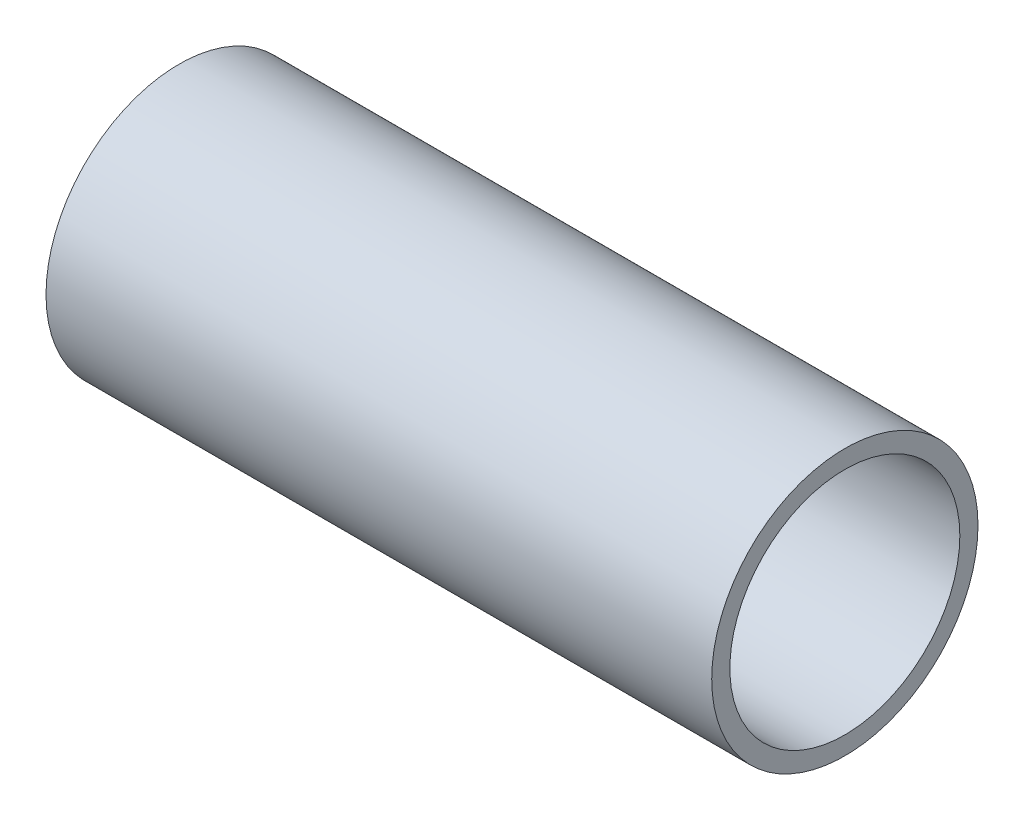
ISO-10303-21;
HEADER;
FILE_DESCRIPTION(('STEP AP214'),'2;1');
FILE_NAME('part.step','',(''),(''),'','','');
FILE_SCHEMA(('AUTOMOTIVE_DESIGN { 1 0 10303 214 1 1 1 1 }'));
ENDSEC;
DATA;
#1=APPLICATION_CONTEXT('core data for automotive mechanical design processes');
#2=APPLICATION_PROTOCOL_DEFINITION('international standard','automotive_design',2000,#1);
#3=PRODUCT_CONTEXT('',#1,'mechanical');
#4=PRODUCT('Part','Part','',(#3));
#5=PRODUCT_RELATED_PRODUCT_CATEGORY('part','',(#4));
#6=PRODUCT_DEFINITION_FORMATION('','',#4);
#7=PRODUCT_DEFINITION_CONTEXT('part definition',#1,'design');
#8=PRODUCT_DEFINITION('design','',#6,#7);
#9=PRODUCT_DEFINITION_SHAPE('','',#8);
#10=(LENGTH_UNIT() NAMED_UNIT(*) SI_UNIT(.MILLI.,.METRE.));
#11=(NAMED_UNIT(*) PLANE_ANGLE_UNIT() SI_UNIT($,.RADIAN.));
#12=(NAMED_UNIT(*) SI_UNIT($,.STERADIAN.) SOLID_ANGLE_UNIT());
#13=UNCERTAINTY_MEASURE_WITH_UNIT(LENGTH_MEASURE(1.E-05),#10,'distance_accuracy_value','');
#14=(GEOMETRIC_REPRESENTATION_CONTEXT(3) GLOBAL_UNCERTAINTY_ASSIGNED_CONTEXT((#13)) GLOBAL_UNIT_ASSIGNED_CONTEXT((#10,
#11,#12)) REPRESENTATION_CONTEXT('',''));
#15=CARTESIAN_POINT('',(0.,0.,0.));
#16=DIRECTION('',(0.,0.,1.));
#17=DIRECTION('',(1.,0.,0.));
#18=AXIS2_PLACEMENT_3D('',#15,#16,#17);
#19=CARTESIAN_POINT('',(55.,0.,0.));
#20=DIRECTION('',(1.,0.,0.));
#21=DIRECTION('',(0.,0.,-1.));
#22=AXIS2_PLACEMENT_3D('',#19,#20,#21);
#23=PLANE('',#22);
#24=CARTESIAN_POINT('',(55.,0.,0.));
#25=DIRECTION('',(1.,0.,0.));
#26=DIRECTION('',(0.,0.,-1.));
#27=AXIS2_PLACEMENT_3D('',#24,#25,#26);
#28=CIRCLE('',#27,11.);
#29=CARTESIAN_POINT('',(55.,0.,-11.));
#30=VERTEX_POINT('',#29);
#31=EDGE_CURVE('E10',#30,#30,#28,.T.);
#32=ORIENTED_EDGE('',*,*,#31,.T.);
#33=EDGE_LOOP('',(#32));
#34=FACE_BOUND('',#33,.T.);
#35=CARTESIAN_POINT('',(55.,0.,0.));
#36=DIRECTION('',(1.,0.,0.));
#37=DIRECTION('',(0.,0.,-1.));
#38=AXIS2_PLACEMENT_3D('',#35,#36,#37);
#39=CIRCLE('',#38,9.5);
#40=CARTESIAN_POINT('',(55.,0.,-9.5));
#41=VERTEX_POINT('',#40);
#42=EDGE_CURVE('E42',#41,#41,#39,.T.);
#43=ORIENTED_EDGE('',*,*,#42,.F.);
#44=EDGE_LOOP('',(#43));
#45=FACE_BOUND('',#44,.T.);
#46=ADVANCED_FACE('F31',(#34,#45),#23,.T.);
#47=CARTESIAN_POINT('',(0.,0.,0.));
#48=DIRECTION('',(1.,0.,0.));
#49=DIRECTION('',(0.,0.,-1.));
#50=AXIS2_PLACEMENT_3D('',#47,#48,#49);
#51=PLANE('',#50);
#52=CARTESIAN_POINT('',(0.,0.,0.));
#53=DIRECTION('',(1.,0.,0.));
#54=DIRECTION('',(0.,0.,-1.));
#55=AXIS2_PLACEMENT_3D('',#52,#53,#54);
#56=CIRCLE('',#55,11.);
#57=CARTESIAN_POINT('',(0.,0.,-11.));
#58=VERTEX_POINT('',#57);
#59=EDGE_CURVE('E35',#58,#58,#56,.T.);
#60=ORIENTED_EDGE('',*,*,#59,.F.);
#61=EDGE_LOOP('',(#60));
#62=FACE_BOUND('',#61,.T.);
#63=CARTESIAN_POINT('',(0.,0.,0.));
#64=DIRECTION('',(1.,0.,0.));
#65=DIRECTION('',(0.,0.,-1.));
#66=AXIS2_PLACEMENT_3D('',#63,#64,#65);
#67=CIRCLE('',#66,9.5);
#68=CARTESIAN_POINT('',(0.,0.,-9.5));
#69=VERTEX_POINT('',#68);
#70=EDGE_CURVE('E44',#69,#69,#67,.T.);
#71=ORIENTED_EDGE('',*,*,#70,.T.);
#72=EDGE_LOOP('',(#71));
#73=FACE_BOUND('',#72,.T.);
#74=ADVANCED_FACE('F54',(#62,#73),#51,.F.);
#75=CARTESIAN_POINT('',(55.,0.,0.));
#76=DIRECTION('',(-1.,0.,0.));
#77=DIRECTION('',(0.,0.,1.));
#78=AXIS2_PLACEMENT_3D('',#75,#76,#77);
#79=CYLINDRICAL_SURFACE('',#78,11.);
#80=ORIENTED_EDGE('',*,*,#31,.F.);
#81=EDGE_LOOP('',(#80));
#82=FACE_BOUND('',#81,.T.);
#83=ORIENTED_EDGE('',*,*,#59,.T.);
#84=EDGE_LOOP('',(#83));
#85=FACE_BOUND('',#84,.T.);
#86=ADVANCED_FACE('F33',(#82,#85),#79,.T.);
#87=CARTESIAN_POINT('',(55.,0.,0.));
#88=DIRECTION('',(-1.,0.,0.));
#89=DIRECTION('',(0.,0.,1.));
#90=AXIS2_PLACEMENT_3D('',#87,#88,#89);
#91=CYLINDRICAL_SURFACE('',#90,9.5);
#92=ORIENTED_EDGE('',*,*,#42,.T.);
#93=EDGE_LOOP('',(#92));
#94=FACE_BOUND('',#93,.T.);
#95=ORIENTED_EDGE('',*,*,#70,.F.);
#96=EDGE_LOOP('',(#95));
#97=FACE_BOUND('',#96,.T.);
#98=ADVANCED_FACE('F50',(#94,#97),#91,.F.);
#99=CLOSED_SHELL('',(#46,#74,#86,#98));
#100=MANIFOLD_SOLID_BREP('B2',#99);
#101=ADVANCED_BREP_SHAPE_REPRESENTATION('',(#18,#100),#14);
#102=SHAPE_DEFINITION_REPRESENTATION(#9,#101);
ENDSEC;
END-ISO-10303-21;
